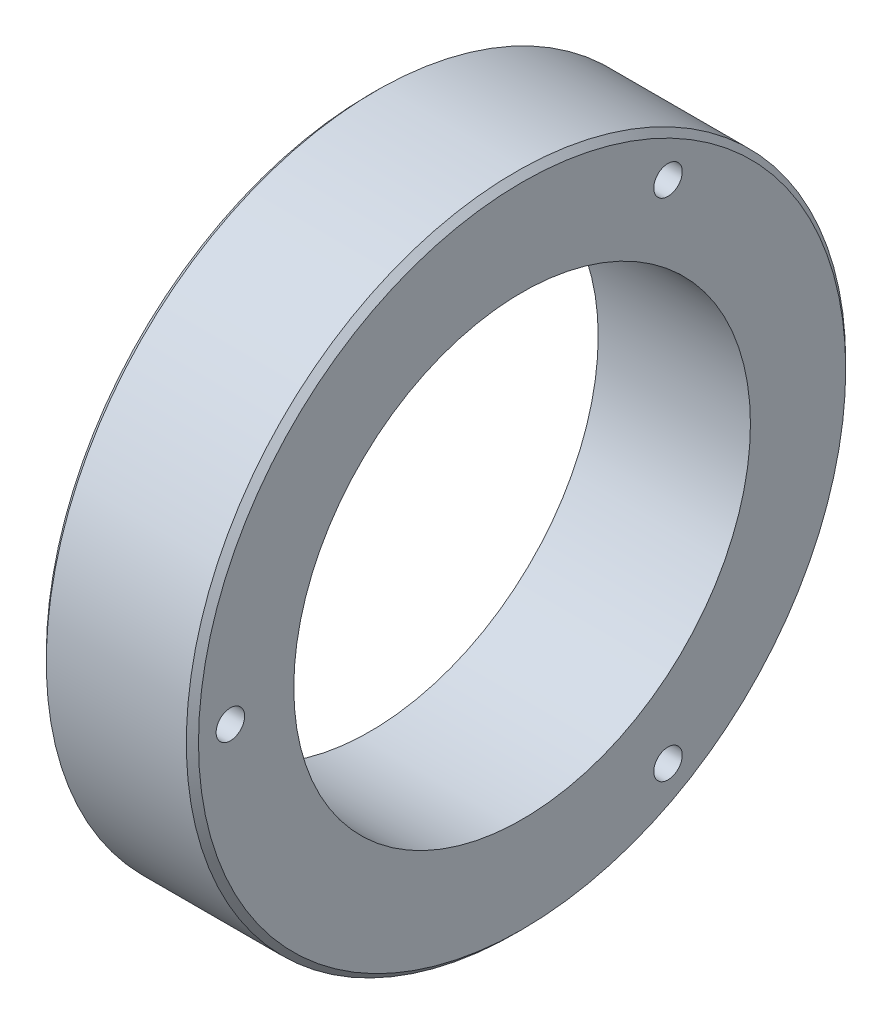
ISO-10303-21;
HEADER;
FILE_DESCRIPTION(('STEP AP214'),'2;1');
FILE_NAME('part.step','',(''),(''),'','','');
FILE_SCHEMA(('AUTOMOTIVE_DESIGN { 1 0 10303 214 1 1 1 1 }'));
ENDSEC;
DATA;
#1=APPLICATION_CONTEXT('core data for automotive mechanical design processes');
#2=APPLICATION_PROTOCOL_DEFINITION('international standard','automotive_design',2000,#1);
#3=PRODUCT_CONTEXT('',#1,'mechanical');
#4=PRODUCT('Part','Part','',(#3));
#5=PRODUCT_RELATED_PRODUCT_CATEGORY('part','',(#4));
#6=PRODUCT_DEFINITION_FORMATION('','',#4);
#7=PRODUCT_DEFINITION_CONTEXT('part definition',#1,'design');
#8=PRODUCT_DEFINITION('design','',#6,#7);
#9=PRODUCT_DEFINITION_SHAPE('','',#8);
#10=(LENGTH_UNIT() NAMED_UNIT(*) SI_UNIT(.MILLI.,.METRE.));
#11=(NAMED_UNIT(*) PLANE_ANGLE_UNIT() SI_UNIT($,.RADIAN.));
#12=(NAMED_UNIT(*) SI_UNIT($,.STERADIAN.) SOLID_ANGLE_UNIT());
#13=UNCERTAINTY_MEASURE_WITH_UNIT(LENGTH_MEASURE(1.E-05),#10,'distance_accuracy_value','');
#14=(GEOMETRIC_REPRESENTATION_CONTEXT(3) GLOBAL_UNCERTAINTY_ASSIGNED_CONTEXT((#13)) GLOBAL_UNIT_ASSIGNED_CONTEXT((#10,
#11,#12)) REPRESENTATION_CONTEXT('',''));
#15=CARTESIAN_POINT('',(0.,0.,0.));
#16=DIRECTION('',(0.,0.,1.));
#17=DIRECTION('',(1.,0.,0.));
#18=AXIS2_PLACEMENT_3D('',#15,#16,#17);
#19=CARTESIAN_POINT('',(38.1,0.,0.));
#20=DIRECTION('',(-1.,0.,0.));
#21=DIRECTION('',(0.,0.,1.));
#22=AXIS2_PLACEMENT_3D('',#19,#20,#21);
#23=CYLINDRICAL_SURFACE('',#22,82.5246);
#24=CARTESIAN_POINT('',(36.576,0.,0.));
#25=DIRECTION('',(1.,0.,0.));
#26=DIRECTION('',(0.,0.,-1.));
#27=AXIS2_PLACEMENT_3D('',#24,#25,#26);
#28=CIRCLE('',#27,82.5246);
#29=CARTESIAN_POINT('',(36.576,0.,-82.5246));
#30=VERTEX_POINT('',#29);
#31=EDGE_CURVE('E47',#30,#30,#28,.F.);
#32=ORIENTED_EDGE('',*,*,#31,.T.);
#33=EDGE_LOOP('',(#32));
#34=FACE_BOUND('',#33,.T.);
#35=CARTESIAN_POINT('',(1.52399999999996,0.,0.));
#36=DIRECTION('',(1.,0.,0.));
#37=DIRECTION('',(0.,0.,-1.));
#38=AXIS2_PLACEMENT_3D('',#35,#36,#37);
#39=CIRCLE('',#38,82.5246);
#40=CARTESIAN_POINT('',(1.52399999999996,0.,-82.5246));
#41=VERTEX_POINT('',#40);
#42=EDGE_CURVE('E51',#41,#41,#39,.T.);
#43=ORIENTED_EDGE('',*,*,#42,.T.);
#44=EDGE_LOOP('',(#43));
#45=FACE_BOUND('',#44,.T.);
#46=ADVANCED_FACE('F39',(#34,#45),#23,.T.);
#47=CARTESIAN_POINT('',(38.1,0.,0.));
#48=DIRECTION('',(1.,0.,0.));
#49=DIRECTION('',(0.,0.,-1.));
#50=AXIS2_PLACEMENT_3D('',#47,#48,#49);
#51=PLANE('',#50);
#52=CARTESIAN_POINT('',(38.1,0.,0.));
#53=DIRECTION('',(1.,0.,0.));
#54=DIRECTION('',(0.,0.,-1.));
#55=AXIS2_PLACEMENT_3D('',#52,#53,#54);
#56=CIRCLE('',#55,81.0006);
#57=CARTESIAN_POINT('',(38.1,0.,-81.0006));
#58=VERTEX_POINT('',#57);
#59=EDGE_CURVE('E55',#58,#58,#56,.T.);
#60=ORIENTED_EDGE('',*,*,#59,.T.);
#61=EDGE_LOOP('',(#60));
#62=FACE_BOUND('',#61,.T.);
#63=CARTESIAN_POINT('',(38.1,0.,73.025));
#64=DIRECTION('',(1.,0.,0.));
#65=DIRECTION('',(0.,0.,-1.));
#66=AXIS2_PLACEMENT_3D('',#63,#64,#65);
#67=CIRCLE('',#66,3.56870000000001);
#68=CARTESIAN_POINT('',(38.1,0.,69.4563));
#69=VERTEX_POINT('',#68);
#70=EDGE_CURVE('E75',#69,#69,#67,.T.);
#71=ORIENTED_EDGE('',*,*,#70,.F.);
#72=EDGE_LOOP('',(#71));
#73=FACE_BOUND('',#72,.T.);
#74=CARTESIAN_POINT('',(38.1,-63.2415051113586,-36.5125));
#75=DIRECTION('',(1.,0.,0.));
#76=DIRECTION('',(0.,0.,-1.));
#77=AXIS2_PLACEMENT_3D('',#74,#75,#76);
#78=CIRCLE('',#77,3.5687);
#79=CARTESIAN_POINT('',(38.1,-63.2415051113586,-40.0812));
#80=VERTEX_POINT('',#79);
#81=EDGE_CURVE('E80',#80,#80,#78,.T.);
#82=ORIENTED_EDGE('',*,*,#81,.F.);
#83=EDGE_LOOP('',(#82));
#84=FACE_BOUND('',#83,.T.);
#85=CARTESIAN_POINT('',(38.1,63.2415051113586,-36.5125));
#86=DIRECTION('',(1.,0.,0.));
#87=DIRECTION('',(0.,0.,-1.));
#88=AXIS2_PLACEMENT_3D('',#85,#86,#87);
#89=CIRCLE('',#88,3.5687);
#90=CARTESIAN_POINT('',(38.1,63.2415051113586,-40.0812));
#91=VERTEX_POINT('',#90);
#92=EDGE_CURVE('E64',#91,#91,#89,.T.);
#93=ORIENTED_EDGE('',*,*,#92,.F.);
#94=EDGE_LOOP('',(#93));
#95=FACE_BOUND('',#94,.T.);
#96=CARTESIAN_POINT('',(38.1,0.,0.));
#97=DIRECTION('',(1.,0.,0.));
#98=DIRECTION('',(0.,0.,-1.));
#99=AXIS2_PLACEMENT_3D('',#96,#97,#98);
#100=CIRCLE('',#99,57.15);
#101=CARTESIAN_POINT('',(38.1,0.,-57.15));
#102=VERTEX_POINT('',#101);
#103=EDGE_CURVE('E60',#102,#102,#100,.T.);
#104=ORIENTED_EDGE('',*,*,#103,.F.);
#105=EDGE_LOOP('',(#104));
#106=FACE_BOUND('',#105,.T.);
#107=ADVANCED_FACE('F121',(#62,#73,#84,#95,#106),#51,.T.);
#108=CARTESIAN_POINT('',(0.,0.,0.));
#109=DIRECTION('',(1.,0.,0.));
#110=DIRECTION('',(0.,0.,-1.));
#111=AXIS2_PLACEMENT_3D('',#108,#109,#110);
#112=PLANE('',#111);
#113=CARTESIAN_POINT('',(0.,0.,0.));
#114=DIRECTION('',(1.,0.,0.));
#115=DIRECTION('',(0.,0.,-1.));
#116=AXIS2_PLACEMENT_3D('',#113,#114,#115);
#117=CIRCLE('',#116,81.0006);
#118=CARTESIAN_POINT('',(0.,0.,-81.0006));
#119=VERTEX_POINT('',#118);
#120=EDGE_CURVE('E10',#119,#119,#117,.F.);
#121=ORIENTED_EDGE('',*,*,#120,.T.);
#122=EDGE_LOOP('',(#121));
#123=FACE_BOUND('',#122,.T.);
#124=CARTESIAN_POINT('',(0.,0.,73.025));
#125=DIRECTION('',(1.,0.,0.));
#126=DIRECTION('',(0.,0.,-1.));
#127=AXIS2_PLACEMENT_3D('',#124,#125,#126);
#128=CIRCLE('',#127,5.5626);
#129=CARTESIAN_POINT('',(0.,0.,67.4624));
#130=VERTEX_POINT('',#129);
#131=EDGE_CURVE('E97',#130,#130,#128,.T.);
#132=ORIENTED_EDGE('',*,*,#131,.T.);
#133=EDGE_LOOP('',(#132));
#134=FACE_BOUND('',#133,.T.);
#135=CARTESIAN_POINT('',(0.,-63.2415051113586,-36.5125));
#136=DIRECTION('',(1.,0.,0.));
#137=DIRECTION('',(0.,0.,-1.));
#138=AXIS2_PLACEMENT_3D('',#135,#136,#137);
#139=CIRCLE('',#138,5.5626);
#140=CARTESIAN_POINT('',(0.,-63.2415051113586,-42.0751));
#141=VERTEX_POINT('',#140);
#142=EDGE_CURVE('E94',#141,#141,#139,.T.);
#143=ORIENTED_EDGE('',*,*,#142,.T.);
#144=EDGE_LOOP('',(#143));
#145=FACE_BOUND('',#144,.T.);
#146=CARTESIAN_POINT('',(0.,63.2415051113586,-36.5125));
#147=DIRECTION('',(1.,0.,0.));
#148=DIRECTION('',(0.,0.,-1.));
#149=AXIS2_PLACEMENT_3D('',#146,#147,#148);
#150=CIRCLE('',#149,5.5626);
#151=CARTESIAN_POINT('',(0.,63.2415051113586,-42.0751));
#152=VERTEX_POINT('',#151);
#153=EDGE_CURVE('E88',#152,#152,#150,.T.);
#154=ORIENTED_EDGE('',*,*,#153,.T.);
#155=EDGE_LOOP('',(#154));
#156=FACE_BOUND('',#155,.T.);
#157=CARTESIAN_POINT('',(0.,0.,0.));
#158=DIRECTION('',(1.,0.,0.));
#159=DIRECTION('',(0.,0.,-1.));
#160=AXIS2_PLACEMENT_3D('',#157,#158,#159);
#161=CIRCLE('',#160,57.15);
#162=CARTESIAN_POINT('',(0.,0.,-57.15));
#163=VERTEX_POINT('',#162);
#164=EDGE_CURVE('E72',#163,#163,#161,.T.);
#165=ORIENTED_EDGE('',*,*,#164,.T.);
#166=EDGE_LOOP('',(#165));
#167=FACE_BOUND('',#166,.T.);
#168=ADVANCED_FACE('F127',(#123,#134,#145,#156,#167),#112,.F.);
#169=CARTESIAN_POINT('',(38.1,0.,0.));
#170=DIRECTION('',(-1.,0.,0.));
#171=DIRECTION('',(0.,0.,1.));
#172=AXIS2_PLACEMENT_3D('',#169,#170,#171);
#173=CYLINDRICAL_SURFACE('',#172,57.15);
#174=ORIENTED_EDGE('',*,*,#103,.T.);
#175=EDGE_LOOP('',(#174));
#176=FACE_BOUND('',#175,.T.);
#177=ORIENTED_EDGE('',*,*,#164,.F.);
#178=EDGE_LOOP('',(#177));
#179=FACE_BOUND('',#178,.T.);
#180=ADVANCED_FACE('F158',(#176,#179),#173,.F.);
#181=CARTESIAN_POINT('',(38.1,63.2415051113586,-36.5125));
#182=DIRECTION('',(-1.,0.,0.));
#183=DIRECTION('',(0.,0.,1.));
#184=AXIS2_PLACEMENT_3D('',#181,#182,#183);
#185=CYLINDRICAL_SURFACE('',#184,3.5687);
#186=CARTESIAN_POINT('',(9.652,63.2415051113586,-36.5125));
#187=DIRECTION('',(1.,0.,0.));
#188=DIRECTION('',(0.,0.,-1.));
#189=AXIS2_PLACEMENT_3D('',#186,#187,#188);
#190=CIRCLE('',#189,3.5687);
#191=CARTESIAN_POINT('',(9.652,63.2415051113586,-40.0812));
#192=VERTEX_POINT('',#191);
#193=EDGE_CURVE('E61',#192,#192,#190,.T.);
#194=ORIENTED_EDGE('',*,*,#193,.F.);
#195=EDGE_LOOP('',(#194));
#196=FACE_BOUND('',#195,.T.);
#197=ORIENTED_EDGE('',*,*,#92,.T.);
#198=EDGE_LOOP('',(#197));
#199=FACE_BOUND('',#198,.T.);
#200=ADVANCED_FACE('F161',(#196,#199),#185,.F.);
#201=CARTESIAN_POINT('',(38.1,-63.2415051113586,-36.5125));
#202=DIRECTION('',(-1.,0.,0.));
#203=DIRECTION('',(0.,0.,1.));
#204=AXIS2_PLACEMENT_3D('',#201,#202,#203);
#205=CYLINDRICAL_SURFACE('',#204,3.5687);
#206=CARTESIAN_POINT('',(9.652,-63.2415051113586,-36.5125));
#207=DIRECTION('',(1.,0.,0.));
#208=DIRECTION('',(0.,0.,-1.));
#209=AXIS2_PLACEMENT_3D('',#206,#207,#208);
#210=CIRCLE('',#209,3.5687);
#211=CARTESIAN_POINT('',(9.652,-63.2415051113586,-40.0812));
#212=VERTEX_POINT('',#211);
#213=EDGE_CURVE('E65',#212,#212,#210,.T.);
#214=ORIENTED_EDGE('',*,*,#213,.F.);
#215=EDGE_LOOP('',(#214));
#216=FACE_BOUND('',#215,.T.);
#217=ORIENTED_EDGE('',*,*,#81,.T.);
#218=EDGE_LOOP('',(#217));
#219=FACE_BOUND('',#218,.T.);
#220=ADVANCED_FACE('F185',(#216,#219),#205,.F.);
#221=CARTESIAN_POINT('',(38.1,0.,73.025));
#222=DIRECTION('',(-1.,0.,0.));
#223=DIRECTION('',(0.,0.,1.));
#224=AXIS2_PLACEMENT_3D('',#221,#222,#223);
#225=CYLINDRICAL_SURFACE('',#224,3.56870000000001);
#226=CARTESIAN_POINT('',(9.652,0.,73.025));
#227=DIRECTION('',(1.,0.,0.));
#228=DIRECTION('',(0.,0.,-1.));
#229=AXIS2_PLACEMENT_3D('',#226,#227,#228);
#230=CIRCLE('',#229,3.56870000000001);
#231=CARTESIAN_POINT('',(9.652,0.,69.4563));
#232=VERTEX_POINT('',#231);
#233=EDGE_CURVE('E68',#232,#232,#230,.T.);
#234=ORIENTED_EDGE('',*,*,#233,.F.);
#235=EDGE_LOOP('',(#234));
#236=FACE_BOUND('',#235,.T.);
#237=ORIENTED_EDGE('',*,*,#70,.T.);
#238=EDGE_LOOP('',(#237));
#239=FACE_BOUND('',#238,.T.);
#240=ADVANCED_FACE('F118',(#236,#239),#225,.F.);
#241=CARTESIAN_POINT('',(9.652,0.,73.025));
#242=DIRECTION('',(-1.,0.,0.));
#243=DIRECTION('',(0.,0.,1.));
#244=AXIS2_PLACEMENT_3D('',#241,#242,#243);
#245=CYLINDRICAL_SURFACE('',#244,5.5626);
#246=CARTESIAN_POINT('',(9.652,0.,73.025));
#247=DIRECTION('',(1.,0.,0.));
#248=DIRECTION('',(0.,0.,-1.));
#249=AXIS2_PLACEMENT_3D('',#246,#247,#248);
#250=CIRCLE('',#249,5.5626);
#251=CARTESIAN_POINT('',(9.652,0.,67.4624));
#252=VERTEX_POINT('',#251);
#253=EDGE_CURVE('E71',#252,#252,#250,.T.);
#254=ORIENTED_EDGE('',*,*,#253,.T.);
#255=EDGE_LOOP('',(#254));
#256=FACE_BOUND('',#255,.T.);
#257=ORIENTED_EDGE('',*,*,#131,.F.);
#258=EDGE_LOOP('',(#257));
#259=FACE_BOUND('',#258,.T.);
#260=ADVANCED_FACE('F103',(#256,#259),#245,.F.);
#261=CARTESIAN_POINT('',(9.652,0.,73.025));
#262=DIRECTION('',(1.,0.,0.));
#263=DIRECTION('',(0.,0.,-1.));
#264=AXIS2_PLACEMENT_3D('',#261,#262,#263);
#265=PLANE('',#264);
#266=ORIENTED_EDGE('',*,*,#233,.T.);
#267=EDGE_LOOP('',(#266));
#268=FACE_BOUND('',#267,.T.);
#269=ORIENTED_EDGE('',*,*,#253,.F.);
#270=EDGE_LOOP('',(#269));
#271=FACE_BOUND('',#270,.T.);
#272=ADVANCED_FACE('F106',(#268,#271),#265,.F.);
#273=CARTESIAN_POINT('',(9.652,-63.2415051113586,-36.5125));
#274=DIRECTION('',(-1.,0.,0.));
#275=DIRECTION('',(0.,0.,1.));
#276=AXIS2_PLACEMENT_3D('',#273,#274,#275);
#277=CYLINDRICAL_SURFACE('',#276,5.5626);
#278=CARTESIAN_POINT('',(9.652,-63.2415051113586,-36.5125));
#279=DIRECTION('',(1.,0.,0.));
#280=DIRECTION('',(0.,0.,-1.));
#281=AXIS2_PLACEMENT_3D('',#278,#279,#280);
#282=CIRCLE('',#281,5.5626);
#283=CARTESIAN_POINT('',(9.652,-63.2415051113586,-42.0751));
#284=VERTEX_POINT('',#283);
#285=EDGE_CURVE('E91',#284,#284,#282,.T.);
#286=ORIENTED_EDGE('',*,*,#285,.T.);
#287=EDGE_LOOP('',(#286));
#288=FACE_BOUND('',#287,.T.);
#289=ORIENTED_EDGE('',*,*,#142,.F.);
#290=EDGE_LOOP('',(#289));
#291=FACE_BOUND('',#290,.T.);
#292=ADVANCED_FACE('F108',(#288,#291),#277,.F.);
#293=CARTESIAN_POINT('',(9.652,-63.2415051113586,-36.5125));
#294=DIRECTION('',(1.,0.,0.));
#295=DIRECTION('',(0.,0.,-1.));
#296=AXIS2_PLACEMENT_3D('',#293,#294,#295);
#297=PLANE('',#296);
#298=ORIENTED_EDGE('',*,*,#213,.T.);
#299=EDGE_LOOP('',(#298));
#300=FACE_BOUND('',#299,.T.);
#301=ORIENTED_EDGE('',*,*,#285,.F.);
#302=EDGE_LOOP('',(#301));
#303=FACE_BOUND('',#302,.T.);
#304=ADVANCED_FACE('F115',(#300,#303),#297,.F.);
#305=CARTESIAN_POINT('',(9.652,63.2415051113586,-36.5125));
#306=DIRECTION('',(-1.,0.,0.));
#307=DIRECTION('',(0.,0.,1.));
#308=AXIS2_PLACEMENT_3D('',#305,#306,#307);
#309=CYLINDRICAL_SURFACE('',#308,5.5626);
#310=CARTESIAN_POINT('',(9.652,63.2415051113586,-36.5125));
#311=DIRECTION('',(1.,0.,0.));
#312=DIRECTION('',(0.,0.,-1.));
#313=AXIS2_PLACEMENT_3D('',#310,#311,#312);
#314=CIRCLE('',#313,5.5626);
#315=CARTESIAN_POINT('',(9.652,63.2415051113586,-42.0751));
#316=VERTEX_POINT('',#315);
#317=EDGE_CURVE('E85',#316,#316,#314,.T.);
#318=ORIENTED_EDGE('',*,*,#317,.T.);
#319=EDGE_LOOP('',(#318));
#320=FACE_BOUND('',#319,.T.);
#321=ORIENTED_EDGE('',*,*,#153,.F.);
#322=EDGE_LOOP('',(#321));
#323=FACE_BOUND('',#322,.T.);
#324=ADVANCED_FACE('F144',(#320,#323),#309,.F.);
#325=CARTESIAN_POINT('',(9.652,63.2415051113586,-36.5125));
#326=DIRECTION('',(1.,0.,0.));
#327=DIRECTION('',(0.,0.,-1.));
#328=AXIS2_PLACEMENT_3D('',#325,#326,#327);
#329=PLANE('',#328);
#330=ORIENTED_EDGE('',*,*,#193,.T.);
#331=EDGE_LOOP('',(#330));
#332=FACE_BOUND('',#331,.T.);
#333=ORIENTED_EDGE('',*,*,#317,.F.);
#334=EDGE_LOOP('',(#333));
#335=FACE_BOUND('',#334,.T.);
#336=ADVANCED_FACE('F137',(#332,#335),#329,.F.);
#337=CARTESIAN_POINT('',(38.1,0.,0.));
#338=DIRECTION('',(-1.,0.,0.));
#339=DIRECTION('',(0.,0.,1.));
#340=AXIS2_PLACEMENT_3D('',#337,#338,#339);
#341=CONICAL_SURFACE('',#340,81.0006,0.785398163397448);
#342=ORIENTED_EDGE('',*,*,#31,.F.);
#343=EDGE_LOOP('',(#342));
#344=FACE_BOUND('',#343,.T.);
#345=ORIENTED_EDGE('',*,*,#59,.F.);
#346=EDGE_LOOP('',(#345));
#347=FACE_BOUND('',#346,.T.);
#348=ADVANCED_FACE('F133',(#344,#347),#341,.T.);
#349=CARTESIAN_POINT('',(1.52399999999996,0.,0.));
#350=DIRECTION('',(1.,0.,0.));
#351=DIRECTION('',(0.,0.,-1.));
#352=AXIS2_PLACEMENT_3D('',#349,#350,#351);
#353=CONICAL_SURFACE('',#352,82.5246,0.785398163397457);
#354=ORIENTED_EDGE('',*,*,#120,.F.);
#355=EDGE_LOOP('',(#354));
#356=FACE_BOUND('',#355,.T.);
#357=ORIENTED_EDGE('',*,*,#42,.F.);
#358=EDGE_LOOP('',(#357));
#359=FACE_BOUND('',#358,.T.);
#360=ADVANCED_FACE('F42',(#356,#359),#353,.T.);
#361=CLOSED_SHELL('',(#46,#107,#168,#180,#200,#220,#240,#260,#272,#292,#304,#324,#336,#348,#360));
#362=MANIFOLD_SOLID_BREP('B2',#361);
#363=ADVANCED_BREP_SHAPE_REPRESENTATION('',(#18,#362),#14);
#364=SHAPE_DEFINITION_REPRESENTATION(#9,#363);
ENDSEC;
END-ISO-10303-21;
